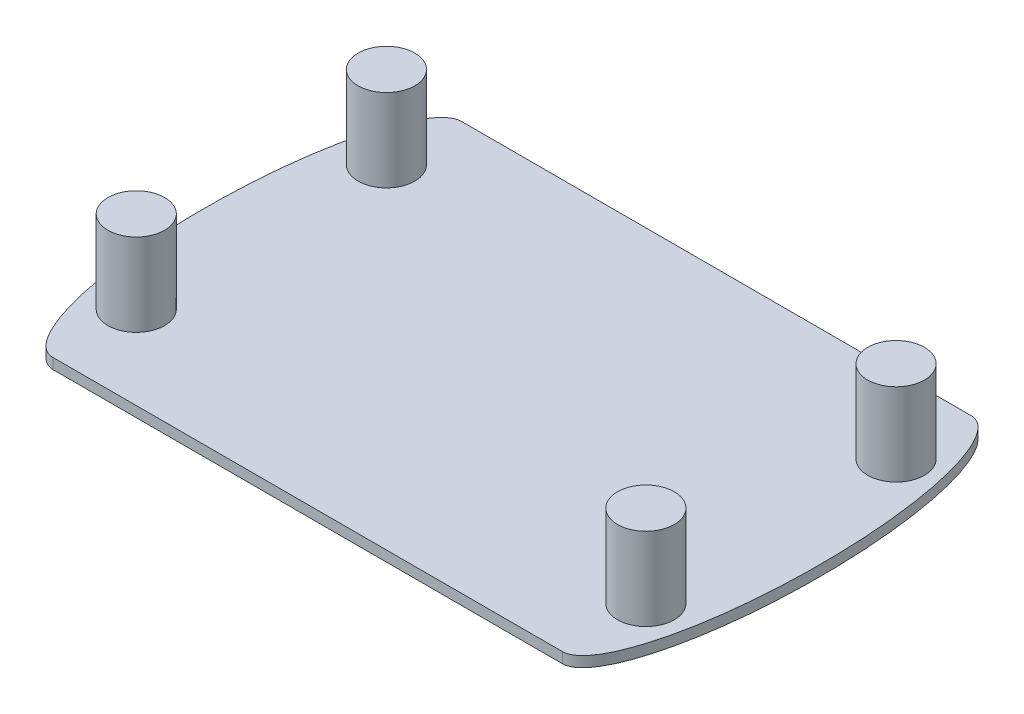
ISO-10303-21;
HEADER;
FILE_DESCRIPTION(('STEP AP214'),'2;1');
FILE_NAME('part.step','',(''),(''),'','','');
FILE_SCHEMA(('AUTOMOTIVE_DESIGN { 1 0 10303 214 1 1 1 1 }'));
ENDSEC;
DATA;
#1=APPLICATION_CONTEXT('core data for automotive mechanical design processes');
#2=APPLICATION_PROTOCOL_DEFINITION('international standard','automotive_design',2000,#1);
#3=PRODUCT_CONTEXT('',#1,'mechanical');
#4=PRODUCT('Part','Part','',(#3));
#5=PRODUCT_RELATED_PRODUCT_CATEGORY('part','',(#4));
#6=PRODUCT_DEFINITION_FORMATION('','',#4);
#7=PRODUCT_DEFINITION_CONTEXT('part definition',#1,'design');
#8=PRODUCT_DEFINITION('design','',#6,#7);
#9=PRODUCT_DEFINITION_SHAPE('','',#8);
#10=(LENGTH_UNIT() NAMED_UNIT(*) SI_UNIT(.MILLI.,.METRE.));
#11=(NAMED_UNIT(*) PLANE_ANGLE_UNIT() SI_UNIT($,.RADIAN.));
#12=(NAMED_UNIT(*) SI_UNIT($,.STERADIAN.) SOLID_ANGLE_UNIT());
#13=UNCERTAINTY_MEASURE_WITH_UNIT(LENGTH_MEASURE(1.E-05),#10,'distance_accuracy_value','');
#14=(GEOMETRIC_REPRESENTATION_CONTEXT(3) GLOBAL_UNCERTAINTY_ASSIGNED_CONTEXT((#13)) GLOBAL_UNIT_ASSIGNED_CONTEXT((#10,
#11,#12)) REPRESENTATION_CONTEXT('',''));
#15=CARTESIAN_POINT('',(0.,0.,0.));
#16=DIRECTION('',(0.,0.,1.));
#17=DIRECTION('',(1.,0.,0.));
#18=AXIS2_PLACEMENT_3D('',#15,#16,#17);
#19=CARTESIAN_POINT('',(-30.55,9.9,-30.));
#20=DIRECTION('',(0.,-1.,0.));
#21=DIRECTION('',(0.,0.,-1.));
#22=AXIS2_PLACEMENT_3D('',#19,#20,#21);
#23=CYLINDRICAL_SURFACE('',#22,3.4);
#24=CARTESIAN_POINT('',(-30.55,9.9,-30.));
#25=DIRECTION('',(0.,1.,0.));
#26=DIRECTION('',(0.,0.,1.));
#27=AXIS2_PLACEMENT_3D('',#24,#25,#26);
#28=CIRCLE('',#27,3.4);
#29=CARTESIAN_POINT('',(-30.55,9.9,-33.4));
#30=VERTEX_POINT('',#29);
#31=EDGE_CURVE('E11',#30,#30,#28,.T.);
#32=CARTESIAN_POINT('',(-30.55,0.,-30.));
#33=DIRECTION('',(0.,1.,0.));
#34=DIRECTION('',(0.,0.,1.));
#35=AXIS2_PLACEMENT_3D('',#32,#33,#34);
#36=CIRCLE('',#35,3.4);
#37=CARTESIAN_POINT('',(-30.55,0.,-33.4));
#38=VERTEX_POINT('',#37);
#39=EDGE_CURVE('E43',#38,#38,#36,.T.);
#40=CARTESIAN_POINT('',(-30.55,9.9,-33.4));
#41=CARTESIAN_POINT('',(-30.55,9.796875,-33.4));
#42=CARTESIAN_POINT('',(-30.55,9.69375,-33.4));
#43=CARTESIAN_POINT('',(-30.55,9.4875,-33.4));
#44=CARTESIAN_POINT('',(-30.55,9.384375,-33.4));
#45=CARTESIAN_POINT('',(-30.55,9.178125,-33.4));
#46=CARTESIAN_POINT('',(-30.55,9.075,-33.4));
#47=CARTESIAN_POINT('',(-30.55,8.86875,-33.4));
#48=CARTESIAN_POINT('',(-30.55,8.765625,-33.4));
#49=CARTESIAN_POINT('',(-30.55,8.559375,-33.4));
#50=CARTESIAN_POINT('',(-30.55,8.45625,-33.4));
#51=CARTESIAN_POINT('',(-30.55,8.25,-33.4));
#52=CARTESIAN_POINT('',(-30.55,8.146875,-33.4));
#53=CARTESIAN_POINT('',(-30.55,7.940625,-33.4));
#54=CARTESIAN_POINT('',(-30.55,7.8375,-33.4));
#55=CARTESIAN_POINT('',(-30.55,7.63125,-33.4));
#56=CARTESIAN_POINT('',(-30.55,7.528125,-33.4));
#57=CARTESIAN_POINT('',(-30.55,7.321875,-33.4));
#58=CARTESIAN_POINT('',(-30.55,7.21875,-33.4));
#59=CARTESIAN_POINT('',(-30.55,7.0125,-33.4));
#60=CARTESIAN_POINT('',(-30.55,6.909375,-33.4));
#61=CARTESIAN_POINT('',(-30.55,6.703125,-33.4));
#62=CARTESIAN_POINT('',(-30.55,6.6,-33.4));
#63=CARTESIAN_POINT('',(-30.55,6.39375,-33.4));
#64=CARTESIAN_POINT('',(-30.55,6.290625,-33.4));
#65=CARTESIAN_POINT('',(-30.55,6.084375,-33.4));
#66=CARTESIAN_POINT('',(-30.55,5.98125,-33.4));
#67=CARTESIAN_POINT('',(-30.55,5.775,-33.4));
#68=CARTESIAN_POINT('',(-30.55,5.671875,-33.4));
#69=CARTESIAN_POINT('',(-30.55,5.465625,-33.4));
#70=CARTESIAN_POINT('',(-30.55,5.3625,-33.4));
#71=CARTESIAN_POINT('',(-30.55,5.15625,-33.4));
#72=CARTESIAN_POINT('',(-30.55,5.053125,-33.4));
#73=CARTESIAN_POINT('',(-30.55,4.846875,-33.4));
#74=CARTESIAN_POINT('',(-30.55,4.74375,-33.4));
#75=CARTESIAN_POINT('',(-30.55,4.5375,-33.4));
#76=CARTESIAN_POINT('',(-30.55,4.434375,-33.4));
#77=CARTESIAN_POINT('',(-30.55,4.228125,-33.4));
#78=CARTESIAN_POINT('',(-30.55,4.125,-33.4));
#79=CARTESIAN_POINT('',(-30.55,3.91875,-33.4));
#80=CARTESIAN_POINT('',(-30.55,3.815625,-33.4));
#81=CARTESIAN_POINT('',(-30.55,3.609375,-33.4));
#82=CARTESIAN_POINT('',(-30.55,3.50625,-33.4));
#83=CARTESIAN_POINT('',(-30.55,3.3,-33.4));
#84=CARTESIAN_POINT('',(-30.55,3.196875,-33.4));
#85=CARTESIAN_POINT('',(-30.55,2.990625,-33.4));
#86=CARTESIAN_POINT('',(-30.55,2.8875,-33.4));
#87=CARTESIAN_POINT('',(-30.55,2.68125,-33.4));
#88=CARTESIAN_POINT('',(-30.55,2.578125,-33.4));
#89=CARTESIAN_POINT('',(-30.55,2.371875,-33.4));
#90=CARTESIAN_POINT('',(-30.55,2.26875,-33.4));
#91=CARTESIAN_POINT('',(-30.55,2.0625,-33.4));
#92=CARTESIAN_POINT('',(-30.55,1.959375,-33.4));
#93=CARTESIAN_POINT('',(-30.55,1.753125,-33.4));
#94=CARTESIAN_POINT('',(-30.55,1.65,-33.4));
#95=CARTESIAN_POINT('',(-30.55,1.44375,-33.4));
#96=CARTESIAN_POINT('',(-30.55,1.340625,-33.4));
#97=CARTESIAN_POINT('',(-30.55,1.134375,-33.4));
#98=CARTESIAN_POINT('',(-30.55,1.03125,-33.4));
#99=CARTESIAN_POINT('',(-30.55,0.825,-33.4));
#100=CARTESIAN_POINT('',(-30.55,0.721875,-33.4));
#101=CARTESIAN_POINT('',(-30.55,0.515625,-33.4));
#102=CARTESIAN_POINT('',(-30.55,0.4125,-33.4));
#103=CARTESIAN_POINT('',(-30.55,0.20625,-33.4));
#104=CARTESIAN_POINT('',(-30.55,0.103125,-33.4));
#105=CARTESIAN_POINT('',(-30.55,0.,-33.4));
#106=B_SPLINE_CURVE_WITH_KNOTS('',3,(#40,#41,#42,#43,#44,#45,#46,#47,#48,#49,#50,#51,#52,#53,
#54,#55,#56,#57,#58,#59,#60,#61,#62,#63,#64,#65,#66,#67,#68,#69,#70,#71,#72,#73,#74,#75,#76,#77,
#78,#79,#80,#81,#82,#83,#84,#85,#86,#87,#88,#89,#90,#91,#92,#93,#94,#95,#96,#97,#98,#99,#100,
#101,#102,#103,#104,#105),.UNSPECIFIED.,.F.,.F.,(4,2,2,2,2,2,2,2,2,2,2,2,2,2,2,2,2,2,2,2,2,2,2,
2,2,2,2,2,2,2,2,2,4),(0.,0.309374999999999,0.618749999999999,0.928124999999998,1.2375,1.546875,
1.85625,2.165625,2.475,2.784375,3.09375,3.403125,3.7125,4.021875,4.33125,4.640625,4.95,5.259375,
5.56875,5.878125,6.1875,6.496875,6.80625,7.115625,7.425,7.734375,8.04375,8.353125,8.6625,
8.971875,9.28125,9.590625,9.9),.UNSPECIFIED.);
#107=EDGE_CURVE('BSEAM35',#30,#38,#106,.T.);
#108=ORIENTED_EDGE('',*,*,#31,.F.);
#109=ORIENTED_EDGE('',*,*,#39,.T.);
#110=ORIENTED_EDGE('',*,*,#107,.T.);
#111=ORIENTED_EDGE('',*,*,#107,.F.);
#112=EDGE_LOOP('',(#108,#110,#109,#111));
#113=FACE_BOUND('',#112,.T.);
#114=ADVANCED_FACE('F35',(#113),#23,.T.);
#115=CARTESIAN_POINT('',(-30.55,9.9,-30.));
#116=DIRECTION('',(0.,1.,0.));
#117=DIRECTION('',(0.,0.,1.));
#118=AXIS2_PLACEMENT_3D('',#115,#116,#117);
#119=PLANE('',#118);
#120=ORIENTED_EDGE('',*,*,#31,.T.);
#121=EDGE_LOOP('',(#120));
#122=FACE_BOUND('',#121,.T.);
#123=ADVANCED_FACE('F111',(#122),#119,.T.);
#124=CARTESIAN_POINT('',(30.55,-1.26,-14.5));
#125=DIRECTION('',(0.,-1.,0.));
#126=DIRECTION('',(0.,0.,-1.));
#127=AXIS2_PLACEMENT_3D('',#124,#125,#126);
#128=ELLIPSE('',#127,24.5,6.40055220003485);
#129=DIRECTION('',(0.,1.,0.));
#130=VECTOR('',#129,1.);
#131=SURFACE_OF_LINEAR_EXTRUSION('',#128,#130);
#132=CARTESIAN_POINT('',(30.55,0.,-14.5));
#133=DIRECTION('',(0.,-1.,0.));
#134=DIRECTION('',(0.,0.,-1.));
#135=AXIS2_PLACEMENT_3D('',#132,#133,#134);
#136=ELLIPSE('',#135,24.5,6.40055220003485);
#137=CARTESIAN_POINT('',(30.55,0.,-39.));
#138=VERTEX_POINT('',#137);
#139=CARTESIAN_POINT('',(30.55,0.,10.));
#140=VERTEX_POINT('',#139);
#141=EDGE_CURVE('E123',#138,#140,#136,.T.);
#142=ORIENTED_EDGE('',*,*,#141,.T.);
#143=DIRECTION('',(0.,1.,0.));
#144=VECTOR('',#143,1.);
#145=CARTESIAN_POINT('',(30.55,-1.26,10.));
#146=LINE('',#145,#144);
#147=CARTESIAN_POINT('',(30.55,-1.26,10.));
#148=VERTEX_POINT('',#147);
#149=EDGE_CURVE('E75',#148,#140,#146,.T.);
#150=ORIENTED_EDGE('',*,*,#149,.F.);
#151=CARTESIAN_POINT('',(30.55,-1.26,-39.));
#152=VERTEX_POINT('',#151);
#153=EDGE_CURVE('E51',#152,#148,#128,.T.);
#154=ORIENTED_EDGE('',*,*,#153,.F.);
#155=DIRECTION('',(0.,1.,0.));
#156=VECTOR('',#155,1.);
#157=CARTESIAN_POINT('',(30.55,-1.26,-39.));
#158=LINE('',#157,#156);
#159=EDGE_CURVE('E89',#152,#138,#158,.T.);
#160=ORIENTED_EDGE('',*,*,#159,.T.);
#161=EDGE_LOOP('',(#142,#150,#154,#160));
#162=FACE_BOUND('',#161,.T.);
#163=ADVANCED_FACE('F109',(#162),#131,.F.);
#164=CARTESIAN_POINT('',(0.,-1.26,10.));
#165=DIRECTION('',(0.,0.,1.));
#166=DIRECTION('',(1.,0.,0.));
#167=AXIS2_PLACEMENT_3D('',#164,#165,#166);
#168=PLANE('',#167);
#169=DIRECTION('',(1.,0.,0.));
#170=VECTOR('',#169,1.);
#171=CARTESIAN_POINT('',(0.,0.,10.));
#172=LINE('',#171,#170);
#173=CARTESIAN_POINT('',(-30.55,0.,10.));
#174=VERTEX_POINT('',#173);
#175=EDGE_CURVE('E115',#174,#140,#172,.T.);
#176=ORIENTED_EDGE('',*,*,#175,.F.);
#177=DIRECTION('',(0.,1.,0.));
#178=VECTOR('',#177,1.);
#179=CARTESIAN_POINT('',(-30.55,-1.26,10.));
#180=LINE('',#179,#178);
#181=CARTESIAN_POINT('',(-30.55,-1.26,10.));
#182=VERTEX_POINT('',#181);
#183=EDGE_CURVE('E68',#182,#174,#180,.T.);
#184=ORIENTED_EDGE('',*,*,#183,.F.);
#185=DIRECTION('',(1.,0.,0.));
#186=VECTOR('',#185,1.);
#187=CARTESIAN_POINT('',(0.,-1.26,10.));
#188=LINE('',#187,#186);
#189=EDGE_CURVE('E95',#182,#148,#188,.T.);
#190=ORIENTED_EDGE('',*,*,#189,.T.);
#191=ORIENTED_EDGE('',*,*,#149,.T.);
#192=EDGE_LOOP('',(#176,#184,#190,#191));
#193=FACE_BOUND('',#192,.T.);
#194=ADVANCED_FACE('F105',(#193),#168,.T.);
#195=CARTESIAN_POINT('',(-30.55,-1.26,-14.5));
#196=DIRECTION('',(0.,1.,0.));
#197=DIRECTION('',(0.,0.,-1.));
#198=AXIS2_PLACEMENT_3D('',#195,#196,#197);
#199=ELLIPSE('',#198,24.5,6.40055220003485);
#200=DIRECTION('',(0.,1.,0.));
#201=VECTOR('',#200,1.);
#202=SURFACE_OF_LINEAR_EXTRUSION('',#199,#201);
#203=CARTESIAN_POINT('',(-30.55,0.,-14.5));
#204=DIRECTION('',(0.,1.,0.));
#205=DIRECTION('',(0.,0.,-1.));
#206=AXIS2_PLACEMENT_3D('',#203,#204,#205);
#207=ELLIPSE('',#206,24.5,6.40055220003485);
#208=CARTESIAN_POINT('',(-30.55,0.,-39.));
#209=VERTEX_POINT('',#208);
#210=EDGE_CURVE('E86',#209,#174,#207,.T.);
#211=ORIENTED_EDGE('',*,*,#210,.F.);
#212=DIRECTION('',(0.,1.,0.));
#213=VECTOR('',#212,1.);
#214=CARTESIAN_POINT('',(-30.55,-1.26,-39.));
#215=LINE('',#214,#213);
#216=CARTESIAN_POINT('',(-30.55,-1.26,-39.));
#217=VERTEX_POINT('',#216);
#218=EDGE_CURVE('E83',#217,#209,#215,.T.);
#219=ORIENTED_EDGE('',*,*,#218,.F.);
#220=EDGE_CURVE('E85',#217,#182,#199,.T.);
#221=ORIENTED_EDGE('',*,*,#220,.T.);
#222=ORIENTED_EDGE('',*,*,#183,.T.);
#223=EDGE_LOOP('',(#211,#219,#221,#222));
#224=FACE_BOUND('',#223,.T.);
#225=ADVANCED_FACE('F84',(#224),#202,.T.);
#226=CARTESIAN_POINT('',(0.,-1.26,-39.));
#227=DIRECTION('',(0.,0.,1.));
#228=DIRECTION('',(1.,0.,0.));
#229=AXIS2_PLACEMENT_3D('',#226,#227,#228);
#230=PLANE('',#229);
#231=DIRECTION('',(1.,0.,0.));
#232=VECTOR('',#231,1.);
#233=CARTESIAN_POINT('',(0.,0.,-39.));
#234=LINE('',#233,#232);
#235=EDGE_CURVE('E158',#209,#138,#234,.T.);
#236=ORIENTED_EDGE('',*,*,#235,.T.);
#237=ORIENTED_EDGE('',*,*,#159,.F.);
#238=DIRECTION('',(1.,0.,0.));
#239=VECTOR('',#238,1.);
#240=CARTESIAN_POINT('',(0.,-1.26,-39.));
#241=LINE('',#240,#239);
#242=EDGE_CURVE('E80',#217,#152,#241,.T.);
#243=ORIENTED_EDGE('',*,*,#242,.F.);
#244=ORIENTED_EDGE('',*,*,#218,.T.);
#245=EDGE_LOOP('',(#236,#237,#243,#244));
#246=FACE_BOUND('',#245,.T.);
#247=ADVANCED_FACE('F91',(#246),#230,.F.);
#248=CARTESIAN_POINT('',(0.,-1.26,0.));
#249=DIRECTION('',(0.,1.,0.));
#250=DIRECTION('',(0.,0.,1.));
#251=AXIS2_PLACEMENT_3D('',#248,#249,#250);
#252=PLANE('',#251);
#253=ORIENTED_EDGE('',*,*,#153,.T.);
#254=ORIENTED_EDGE('',*,*,#189,.F.);
#255=ORIENTED_EDGE('',*,*,#220,.F.);
#256=ORIENTED_EDGE('',*,*,#242,.T.);
#257=EDGE_LOOP('',(#253,#254,#255,#256));
#258=FACE_BOUND('',#257,.T.);
#259=ADVANCED_FACE('F94',(#258),#252,.F.);
#260=CARTESIAN_POINT('',(0.,0.,0.));
#261=DIRECTION('',(0.,1.,0.));
#262=DIRECTION('',(0.,0.,1.));
#263=AXIS2_PLACEMENT_3D('',#260,#261,#262);
#264=PLANE('',#263);
#265=CARTESIAN_POINT('',(30.55,0.,-30.));
#266=DIRECTION('',(0.,1.,0.));
#267=DIRECTION('',(0.,0.,-1.));
#268=AXIS2_PLACEMENT_3D('',#265,#266,#267);
#269=CIRCLE('',#268,3.4);
#270=CARTESIAN_POINT('',(30.55,0.,-33.4));
#271=VERTEX_POINT('',#270);
#272=EDGE_CURVE('E130',#271,#271,#269,.T.);
#273=ORIENTED_EDGE('',*,*,#272,.F.);
#274=EDGE_LOOP('',(#273));
#275=FACE_BOUND('',#274,.T.);
#276=CARTESIAN_POINT('',(30.55,0.,0.));
#277=DIRECTION('',(0.,1.,0.));
#278=DIRECTION('',(0.,0.,-1.));
#279=AXIS2_PLACEMENT_3D('',#276,#277,#278);
#280=CIRCLE('',#279,3.4);
#281=CARTESIAN_POINT('',(30.55,0.,-3.4));
#282=VERTEX_POINT('',#281);
#283=EDGE_CURVE('E124',#282,#282,#280,.T.);
#284=ORIENTED_EDGE('',*,*,#283,.F.);
#285=EDGE_LOOP('',(#284));
#286=FACE_BOUND('',#285,.T.);
#287=CARTESIAN_POINT('',(-30.55,0.,0.));
#288=DIRECTION('',(0.,1.,0.));
#289=DIRECTION('',(0.,0.,1.));
#290=AXIS2_PLACEMENT_3D('',#287,#288,#289);
#291=CIRCLE('',#290,3.4);
#292=CARTESIAN_POINT('',(-30.55,0.,-3.4));
#293=VERTEX_POINT('',#292);
#294=EDGE_CURVE('E116',#293,#293,#291,.T.);
#295=ORIENTED_EDGE('',*,*,#294,.F.);
#296=EDGE_LOOP('',(#295));
#297=FACE_BOUND('',#296,.T.);
#298=ORIENTED_EDGE('',*,*,#39,.F.);
#299=EDGE_LOOP('',(#298));
#300=FACE_BOUND('',#299,.T.);
#301=ORIENTED_EDGE('',*,*,#141,.F.);
#302=ORIENTED_EDGE('',*,*,#235,.F.);
#303=ORIENTED_EDGE('',*,*,#210,.T.);
#304=ORIENTED_EDGE('',*,*,#175,.T.);
#305=EDGE_LOOP('',(#301,#302,#303,#304));
#306=FACE_BOUND('',#305,.T.);
#307=ADVANCED_FACE('F145',(#275,#286,#297,#300,#306),#264,.T.);
#308=CARTESIAN_POINT('',(-30.55,9.9,0.));
#309=DIRECTION('',(0.,-1.,0.));
#310=DIRECTION('',(0.,0.,-1.));
#311=AXIS2_PLACEMENT_3D('',#308,#309,#310);
#312=CYLINDRICAL_SURFACE('',#311,3.4);
#313=CARTESIAN_POINT('',(-30.55,9.9,0.));
#314=DIRECTION('',(0.,1.,0.));
#315=DIRECTION('',(0.,0.,1.));
#316=AXIS2_PLACEMENT_3D('',#313,#314,#315);
#317=CIRCLE('',#316,3.4);
#318=CARTESIAN_POINT('',(-30.55,9.9,-3.4));
#319=VERTEX_POINT('',#318);
#320=EDGE_CURVE('E119',#319,#319,#317,.T.);
#321=CARTESIAN_POINT('',(-30.55,9.9,-3.4));
#322=CARTESIAN_POINT('',(-30.55,9.796875,-3.4));
#323=CARTESIAN_POINT('',(-30.55,9.69375,-3.4));
#324=CARTESIAN_POINT('',(-30.55,9.4875,-3.4));
#325=CARTESIAN_POINT('',(-30.55,9.384375,-3.4));
#326=CARTESIAN_POINT('',(-30.55,9.178125,-3.4));
#327=CARTESIAN_POINT('',(-30.55,9.075,-3.4));
#328=CARTESIAN_POINT('',(-30.55,8.86875,-3.4));
#329=CARTESIAN_POINT('',(-30.55,8.765625,-3.4));
#330=CARTESIAN_POINT('',(-30.55,8.559375,-3.4));
#331=CARTESIAN_POINT('',(-30.55,8.45625,-3.4));
#332=CARTESIAN_POINT('',(-30.55,8.25,-3.4));
#333=CARTESIAN_POINT('',(-30.55,8.146875,-3.4));
#334=CARTESIAN_POINT('',(-30.55,7.940625,-3.4));
#335=CARTESIAN_POINT('',(-30.55,7.8375,-3.4));
#336=CARTESIAN_POINT('',(-30.55,7.63125,-3.4));
#337=CARTESIAN_POINT('',(-30.55,7.528125,-3.4));
#338=CARTESIAN_POINT('',(-30.55,7.321875,-3.4));
#339=CARTESIAN_POINT('',(-30.55,7.21875,-3.4));
#340=CARTESIAN_POINT('',(-30.55,7.0125,-3.4));
#341=CARTESIAN_POINT('',(-30.55,6.909375,-3.4));
#342=CARTESIAN_POINT('',(-30.55,6.703125,-3.4));
#343=CARTESIAN_POINT('',(-30.55,6.6,-3.4));
#344=CARTESIAN_POINT('',(-30.55,6.39375,-3.4));
#345=CARTESIAN_POINT('',(-30.55,6.290625,-3.4));
#346=CARTESIAN_POINT('',(-30.55,6.084375,-3.4));
#347=CARTESIAN_POINT('',(-30.55,5.98125,-3.4));
#348=CARTESIAN_POINT('',(-30.55,5.775,-3.4));
#349=CARTESIAN_POINT('',(-30.55,5.671875,-3.4));
#350=CARTESIAN_POINT('',(-30.55,5.465625,-3.4));
#351=CARTESIAN_POINT('',(-30.55,5.3625,-3.4));
#352=CARTESIAN_POINT('',(-30.55,5.15625,-3.4));
#353=CARTESIAN_POINT('',(-30.55,5.053125,-3.4));
#354=CARTESIAN_POINT('',(-30.55,4.846875,-3.4));
#355=CARTESIAN_POINT('',(-30.55,4.74375,-3.4));
#356=CARTESIAN_POINT('',(-30.55,4.5375,-3.4));
#357=CARTESIAN_POINT('',(-30.55,4.434375,-3.4));
#358=CARTESIAN_POINT('',(-30.55,4.228125,-3.4));
#359=CARTESIAN_POINT('',(-30.55,4.125,-3.4));
#360=CARTESIAN_POINT('',(-30.55,3.91875,-3.4));
#361=CARTESIAN_POINT('',(-30.55,3.815625,-3.4));
#362=CARTESIAN_POINT('',(-30.55,3.609375,-3.4));
#363=CARTESIAN_POINT('',(-30.55,3.50625,-3.4));
#364=CARTESIAN_POINT('',(-30.55,3.3,-3.4));
#365=CARTESIAN_POINT('',(-30.55,3.196875,-3.4));
#366=CARTESIAN_POINT('',(-30.55,2.990625,-3.4));
#367=CARTESIAN_POINT('',(-30.55,2.8875,-3.4));
#368=CARTESIAN_POINT('',(-30.55,2.68125,-3.4));
#369=CARTESIAN_POINT('',(-30.55,2.578125,-3.4));
#370=CARTESIAN_POINT('',(-30.55,2.371875,-3.4));
#371=CARTESIAN_POINT('',(-30.55,2.26875,-3.4));
#372=CARTESIAN_POINT('',(-30.55,2.0625,-3.4));
#373=CARTESIAN_POINT('',(-30.55,1.959375,-3.4));
#374=CARTESIAN_POINT('',(-30.55,1.753125,-3.4));
#375=CARTESIAN_POINT('',(-30.55,1.65,-3.4));
#376=CARTESIAN_POINT('',(-30.55,1.44375,-3.4));
#377=CARTESIAN_POINT('',(-30.55,1.340625,-3.4));
#378=CARTESIAN_POINT('',(-30.55,1.134375,-3.4));
#379=CARTESIAN_POINT('',(-30.55,1.03125,-3.4));
#380=CARTESIAN_POINT('',(-30.55,0.825,-3.4));
#381=CARTESIAN_POINT('',(-30.55,0.721875,-3.4));
#382=CARTESIAN_POINT('',(-30.55,0.515625,-3.4));
#383=CARTESIAN_POINT('',(-30.55,0.4125,-3.4));
#384=CARTESIAN_POINT('',(-30.55,0.20625,-3.4));
#385=CARTESIAN_POINT('',(-30.55,0.103125,-3.4));
#386=CARTESIAN_POINT('',(-30.55,0.,-3.4));
#387=B_SPLINE_CURVE_WITH_KNOTS('',3,(#321,#322,#323,#324,#325,#326,#327,#328,#329,#330,#331,
#332,#333,#334,#335,#336,#337,#338,#339,#340,#341,#342,#343,#344,#345,#346,#347,#348,#349,#350,
#351,#352,#353,#354,#355,#356,#357,#358,#359,#360,#361,#362,#363,#364,#365,#366,#367,#368,#369,
#370,#371,#372,#373,#374,#375,#376,#377,#378,#379,#380,#381,#382,#383,#384,#385,#386),
.UNSPECIFIED.,.F.,.F.,(4,2,2,2,2,2,2,2,2,2,2,2,2,2,2,2,2,2,2,2,2,2,2,2,2,2,2,2,2,2,2,2,4),(0.,
0.309374999999999,0.618749999999999,0.928124999999998,1.2375,1.546875,1.85625,2.165625,2.475,
2.784375,3.09375,3.403125,3.7125,4.021875,4.33125,4.640625,4.95,5.259375,5.56875,5.878125,
6.1875,6.496875,6.80625,7.115625,7.425,7.734375,8.04375,8.353125,8.6625,8.971875,9.28125,
9.590625,9.9),.UNSPECIFIED.);
#388=EDGE_CURVE('BSEAM148',#319,#293,#387,.T.);
#389=ORIENTED_EDGE('',*,*,#320,.F.);
#390=ORIENTED_EDGE('',*,*,#294,.T.);
#391=ORIENTED_EDGE('',*,*,#388,.T.);
#392=ORIENTED_EDGE('',*,*,#388,.F.);
#393=EDGE_LOOP('',(#389,#391,#390,#392));
#394=FACE_BOUND('',#393,.T.);
#395=ADVANCED_FACE('F148',(#394),#312,.T.);
#396=CARTESIAN_POINT('',(-30.55,9.9,0.));
#397=DIRECTION('',(0.,1.,0.));
#398=DIRECTION('',(0.,0.,1.));
#399=AXIS2_PLACEMENT_3D('',#396,#397,#398);
#400=PLANE('',#399);
#401=ORIENTED_EDGE('',*,*,#320,.T.);
#402=EDGE_LOOP('',(#401));
#403=FACE_BOUND('',#402,.T.);
#404=ADVANCED_FACE('F208',(#403),#400,.T.);
#405=CARTESIAN_POINT('',(30.55,9.9,0.));
#406=DIRECTION('',(0.,-1.,0.));
#407=DIRECTION('',(0.,0.,-1.));
#408=AXIS2_PLACEMENT_3D('',#405,#406,#407);
#409=CYLINDRICAL_SURFACE('',#408,3.4);
#410=CARTESIAN_POINT('',(30.55,9.9,0.));
#411=DIRECTION('',(0.,1.,0.));
#412=DIRECTION('',(0.,0.,-1.));
#413=AXIS2_PLACEMENT_3D('',#410,#411,#412);
#414=CIRCLE('',#413,3.4);
#415=CARTESIAN_POINT('',(30.55,9.9,-3.4));
#416=VERTEX_POINT('',#415);
#417=EDGE_CURVE('E120',#416,#416,#414,.T.);
#418=CARTESIAN_POINT('',(30.55,9.9,-3.4));
#419=CARTESIAN_POINT('',(30.55,9.796875,-3.4));
#420=CARTESIAN_POINT('',(30.55,9.69375,-3.4));
#421=CARTESIAN_POINT('',(30.55,9.4875,-3.4));
#422=CARTESIAN_POINT('',(30.55,9.384375,-3.4));
#423=CARTESIAN_POINT('',(30.55,9.178125,-3.4));
#424=CARTESIAN_POINT('',(30.55,9.075,-3.4));
#425=CARTESIAN_POINT('',(30.55,8.86875,-3.4));
#426=CARTESIAN_POINT('',(30.55,8.765625,-3.4));
#427=CARTESIAN_POINT('',(30.55,8.559375,-3.4));
#428=CARTESIAN_POINT('',(30.55,8.45625,-3.4));
#429=CARTESIAN_POINT('',(30.55,8.25,-3.4));
#430=CARTESIAN_POINT('',(30.55,8.146875,-3.4));
#431=CARTESIAN_POINT('',(30.55,7.940625,-3.4));
#432=CARTESIAN_POINT('',(30.55,7.8375,-3.4));
#433=CARTESIAN_POINT('',(30.55,7.63125,-3.4));
#434=CARTESIAN_POINT('',(30.55,7.528125,-3.4));
#435=CARTESIAN_POINT('',(30.55,7.321875,-3.4));
#436=CARTESIAN_POINT('',(30.55,7.21875,-3.4));
#437=CARTESIAN_POINT('',(30.55,7.0125,-3.4));
#438=CARTESIAN_POINT('',(30.55,6.909375,-3.4));
#439=CARTESIAN_POINT('',(30.55,6.703125,-3.4));
#440=CARTESIAN_POINT('',(30.55,6.6,-3.4));
#441=CARTESIAN_POINT('',(30.55,6.39375,-3.4));
#442=CARTESIAN_POINT('',(30.55,6.290625,-3.4));
#443=CARTESIAN_POINT('',(30.55,6.084375,-3.4));
#444=CARTESIAN_POINT('',(30.55,5.98125,-3.4));
#445=CARTESIAN_POINT('',(30.55,5.775,-3.4));
#446=CARTESIAN_POINT('',(30.55,5.671875,-3.4));
#447=CARTESIAN_POINT('',(30.55,5.465625,-3.4));
#448=CARTESIAN_POINT('',(30.55,5.3625,-3.4));
#449=CARTESIAN_POINT('',(30.55,5.15625,-3.4));
#450=CARTESIAN_POINT('',(30.55,5.053125,-3.4));
#451=CARTESIAN_POINT('',(30.55,4.846875,-3.4));
#452=CARTESIAN_POINT('',(30.55,4.74375,-3.4));
#453=CARTESIAN_POINT('',(30.55,4.5375,-3.4));
#454=CARTESIAN_POINT('',(30.55,4.434375,-3.4));
#455=CARTESIAN_POINT('',(30.55,4.228125,-3.4));
#456=CARTESIAN_POINT('',(30.55,4.125,-3.4));
#457=CARTESIAN_POINT('',(30.55,3.91875,-3.4));
#458=CARTESIAN_POINT('',(30.55,3.815625,-3.4));
#459=CARTESIAN_POINT('',(30.55,3.609375,-3.4));
#460=CARTESIAN_POINT('',(30.55,3.50625,-3.4));
#461=CARTESIAN_POINT('',(30.55,3.3,-3.4));
#462=CARTESIAN_POINT('',(30.55,3.196875,-3.4));
#463=CARTESIAN_POINT('',(30.55,2.990625,-3.4));
#464=CARTESIAN_POINT('',(30.55,2.8875,-3.4));
#465=CARTESIAN_POINT('',(30.55,2.68125,-3.4));
#466=CARTESIAN_POINT('',(30.55,2.578125,-3.4));
#467=CARTESIAN_POINT('',(30.55,2.371875,-3.4));
#468=CARTESIAN_POINT('',(30.55,2.26875,-3.4));
#469=CARTESIAN_POINT('',(30.55,2.0625,-3.4));
#470=CARTESIAN_POINT('',(30.55,1.959375,-3.4));
#471=CARTESIAN_POINT('',(30.55,1.753125,-3.4));
#472=CARTESIAN_POINT('',(30.55,1.65,-3.4));
#473=CARTESIAN_POINT('',(30.55,1.44375,-3.4));
#474=CARTESIAN_POINT('',(30.55,1.340625,-3.4));
#475=CARTESIAN_POINT('',(30.55,1.134375,-3.4));
#476=CARTESIAN_POINT('',(30.55,1.03125,-3.4));
#477=CARTESIAN_POINT('',(30.55,0.825,-3.4));
#478=CARTESIAN_POINT('',(30.55,0.721875,-3.4));
#479=CARTESIAN_POINT('',(30.55,0.515625,-3.4));
#480=CARTESIAN_POINT('',(30.55,0.4125,-3.4));
#481=CARTESIAN_POINT('',(30.55,0.20625,-3.4));
#482=CARTESIAN_POINT('',(30.55,0.103125,-3.4));
#483=CARTESIAN_POINT('',(30.55,0.,-3.4));
#484=B_SPLINE_CURVE_WITH_KNOTS('',3,(#418,#419,#420,#421,#422,#423,#424,#425,#426,#427,#428,
#429,#430,#431,#432,#433,#434,#435,#436,#437,#438,#439,#440,#441,#442,#443,#444,#445,#446,#447,
#448,#449,#450,#451,#452,#453,#454,#455,#456,#457,#458,#459,#460,#461,#462,#463,#464,#465,#466,
#467,#468,#469,#470,#471,#472,#473,#474,#475,#476,#477,#478,#479,#480,#481,#482,#483),
.UNSPECIFIED.,.F.,.F.,(4,2,2,2,2,2,2,2,2,2,2,2,2,2,2,2,2,2,2,2,2,2,2,2,2,2,2,2,2,2,2,2,4),(0.,
0.309374999999999,0.618749999999999,0.928124999999998,1.2375,1.546875,1.85625,2.165625,2.475,
2.784375,3.09375,3.403125,3.7125,4.021875,4.33125,4.640625,4.95,5.259375,5.56875,5.878125,
6.1875,6.496875,6.80625,7.115625,7.425,7.734375,8.04375,8.353125,8.6625,8.971875,9.28125,
9.590625,9.9),.UNSPECIFIED.);
#485=EDGE_CURVE('BSEAM216',#416,#282,#484,.T.);
#486=ORIENTED_EDGE('',*,*,#417,.F.);
#487=ORIENTED_EDGE('',*,*,#283,.T.);
#488=ORIENTED_EDGE('',*,*,#485,.T.);
#489=ORIENTED_EDGE('',*,*,#485,.F.);
#490=EDGE_LOOP('',(#486,#488,#487,#489));
#491=FACE_BOUND('',#490,.T.);
#492=ADVANCED_FACE('F216',(#491),#409,.T.);
#493=CARTESIAN_POINT('',(30.55,9.9,0.));
#494=DIRECTION('',(0.,-1.,0.));
#495=DIRECTION('',(0.,0.,-1.));
#496=AXIS2_PLACEMENT_3D('',#493,#494,#495);
#497=PLANE('',#496);
#498=ORIENTED_EDGE('',*,*,#417,.T.);
#499=EDGE_LOOP('',(#498));
#500=FACE_BOUND('',#499,.T.);
#501=ADVANCED_FACE('F141',(#500),#497,.F.);
#502=CARTESIAN_POINT('',(30.55,9.9,-30.));
#503=DIRECTION('',(0.,-1.,0.));
#504=DIRECTION('',(0.,0.,-1.));
#505=AXIS2_PLACEMENT_3D('',#502,#503,#504);
#506=CYLINDRICAL_SURFACE('',#505,3.4);
#507=CARTESIAN_POINT('',(30.55,9.9,-30.));
#508=DIRECTION('',(0.,1.,0.));
#509=DIRECTION('',(0.,0.,-1.));
#510=AXIS2_PLACEMENT_3D('',#507,#508,#509);
#511=CIRCLE('',#510,3.4);
#512=CARTESIAN_POINT('',(30.55,9.9,-33.4));
#513=VERTEX_POINT('',#512);
#514=EDGE_CURVE('E127',#513,#513,#511,.T.);
#515=CARTESIAN_POINT('',(30.55,9.9,-33.4));
#516=CARTESIAN_POINT('',(30.55,9.796875,-33.4));
#517=CARTESIAN_POINT('',(30.55,9.69375,-33.4));
#518=CARTESIAN_POINT('',(30.55,9.4875,-33.4));
#519=CARTESIAN_POINT('',(30.55,9.384375,-33.4));
#520=CARTESIAN_POINT('',(30.55,9.178125,-33.4));
#521=CARTESIAN_POINT('',(30.55,9.075,-33.4));
#522=CARTESIAN_POINT('',(30.55,8.86875,-33.4));
#523=CARTESIAN_POINT('',(30.55,8.765625,-33.4));
#524=CARTESIAN_POINT('',(30.55,8.559375,-33.4));
#525=CARTESIAN_POINT('',(30.55,8.45625,-33.4));
#526=CARTESIAN_POINT('',(30.55,8.25,-33.4));
#527=CARTESIAN_POINT('',(30.55,8.146875,-33.4));
#528=CARTESIAN_POINT('',(30.55,7.940625,-33.4));
#529=CARTESIAN_POINT('',(30.55,7.8375,-33.4));
#530=CARTESIAN_POINT('',(30.55,7.63125,-33.4));
#531=CARTESIAN_POINT('',(30.55,7.528125,-33.4));
#532=CARTESIAN_POINT('',(30.55,7.321875,-33.4));
#533=CARTESIAN_POINT('',(30.55,7.21875,-33.4));
#534=CARTESIAN_POINT('',(30.55,7.0125,-33.4));
#535=CARTESIAN_POINT('',(30.55,6.909375,-33.4));
#536=CARTESIAN_POINT('',(30.55,6.703125,-33.4));
#537=CARTESIAN_POINT('',(30.55,6.6,-33.4));
#538=CARTESIAN_POINT('',(30.55,6.39375,-33.4));
#539=CARTESIAN_POINT('',(30.55,6.290625,-33.4));
#540=CARTESIAN_POINT('',(30.55,6.084375,-33.4));
#541=CARTESIAN_POINT('',(30.55,5.98125,-33.4));
#542=CARTESIAN_POINT('',(30.55,5.775,-33.4));
#543=CARTESIAN_POINT('',(30.55,5.671875,-33.4));
#544=CARTESIAN_POINT('',(30.55,5.465625,-33.4));
#545=CARTESIAN_POINT('',(30.55,5.3625,-33.4));
#546=CARTESIAN_POINT('',(30.55,5.15625,-33.4));
#547=CARTESIAN_POINT('',(30.55,5.053125,-33.4));
#548=CARTESIAN_POINT('',(30.55,4.846875,-33.4));
#549=CARTESIAN_POINT('',(30.55,4.74375,-33.4));
#550=CARTESIAN_POINT('',(30.55,4.5375,-33.4));
#551=CARTESIAN_POINT('',(30.55,4.434375,-33.4));
#552=CARTESIAN_POINT('',(30.55,4.228125,-33.4));
#553=CARTESIAN_POINT('',(30.55,4.125,-33.4));
#554=CARTESIAN_POINT('',(30.55,3.91875,-33.4));
#555=CARTESIAN_POINT('',(30.55,3.815625,-33.4));
#556=CARTESIAN_POINT('',(30.55,3.609375,-33.4));
#557=CARTESIAN_POINT('',(30.55,3.50625,-33.4));
#558=CARTESIAN_POINT('',(30.55,3.3,-33.4));
#559=CARTESIAN_POINT('',(30.55,3.196875,-33.4));
#560=CARTESIAN_POINT('',(30.55,2.990625,-33.4));
#561=CARTESIAN_POINT('',(30.55,2.8875,-33.4));
#562=CARTESIAN_POINT('',(30.55,2.68125,-33.4));
#563=CARTESIAN_POINT('',(30.55,2.578125,-33.4));
#564=CARTESIAN_POINT('',(30.55,2.371875,-33.4));
#565=CARTESIAN_POINT('',(30.55,2.26875,-33.4));
#566=CARTESIAN_POINT('',(30.55,2.0625,-33.4));
#567=CARTESIAN_POINT('',(30.55,1.959375,-33.4));
#568=CARTESIAN_POINT('',(30.55,1.753125,-33.4));
#569=CARTESIAN_POINT('',(30.55,1.65,-33.4));
#570=CARTESIAN_POINT('',(30.55,1.44375,-33.4));
#571=CARTESIAN_POINT('',(30.55,1.340625,-33.4));
#572=CARTESIAN_POINT('',(30.55,1.134375,-33.4));
#573=CARTESIAN_POINT('',(30.55,1.03125,-33.4));
#574=CARTESIAN_POINT('',(30.55,0.825,-33.4));
#575=CARTESIAN_POINT('',(30.55,0.721875,-33.4));
#576=CARTESIAN_POINT('',(30.55,0.515625,-33.4));
#577=CARTESIAN_POINT('',(30.55,0.4125,-33.4));
#578=CARTESIAN_POINT('',(30.55,0.20625,-33.4));
#579=CARTESIAN_POINT('',(30.55,0.103125,-33.4));
#580=CARTESIAN_POINT('',(30.55,0.,-33.4));
#581=B_SPLINE_CURVE_WITH_KNOTS('',3,(#515,#516,#517,#518,#519,#520,#521,#522,#523,#524,#525,
#526,#527,#528,#529,#530,#531,#532,#533,#534,#535,#536,#537,#538,#539,#540,#541,#542,#543,#544,
#545,#546,#547,#548,#549,#550,#551,#552,#553,#554,#555,#556,#557,#558,#559,#560,#561,#562,#563,
#564,#565,#566,#567,#568,#569,#570,#571,#572,#573,#574,#575,#576,#577,#578,#579,#580),
.UNSPECIFIED.,.F.,.F.,(4,2,2,2,2,2,2,2,2,2,2,2,2,2,2,2,2,2,2,2,2,2,2,2,2,2,2,2,2,2,2,2,4),(0.,
0.309374999999999,0.618749999999999,0.928124999999998,1.2375,1.546875,1.85625,2.165625,2.475,
2.784375,3.09375,3.403125,3.7125,4.021875,4.33125,4.640625,4.95,5.259375,5.56875,5.878125,
6.1875,6.496875,6.80625,7.115625,7.425,7.734375,8.04375,8.353125,8.6625,8.971875,9.28125,
9.590625,9.9),.UNSPECIFIED.);
#582=EDGE_CURVE('BSEAM138',#513,#271,#581,.T.);
#583=ORIENTED_EDGE('',*,*,#514,.F.);
#584=ORIENTED_EDGE('',*,*,#272,.T.);
#585=ORIENTED_EDGE('',*,*,#582,.T.);
#586=ORIENTED_EDGE('',*,*,#582,.F.);
#587=EDGE_LOOP('',(#583,#585,#584,#586));
#588=FACE_BOUND('',#587,.T.);
#589=ADVANCED_FACE('F138',(#588),#506,.T.);
#590=CARTESIAN_POINT('',(30.55,9.9,-30.));
#591=DIRECTION('',(0.,-1.,0.));
#592=DIRECTION('',(0.,0.,-1.));
#593=AXIS2_PLACEMENT_3D('',#590,#591,#592);
#594=PLANE('',#593);
#595=ORIENTED_EDGE('',*,*,#514,.T.);
#596=EDGE_LOOP('',(#595));
#597=FACE_BOUND('',#596,.T.);
#598=ADVANCED_FACE('F136',(#597),#594,.F.);
#599=CLOSED_SHELL('',(#114,#123,#163,#194,#225,#247,#259,#307,#395,#404,#492,#501,#589,#598));
#600=MANIFOLD_SOLID_BREP('B2',#599);
#601=ADVANCED_BREP_SHAPE_REPRESENTATION('',(#18,#600),#14);
#602=SHAPE_DEFINITION_REPRESENTATION(#9,#601);
ENDSEC;
END-ISO-10303-21;
